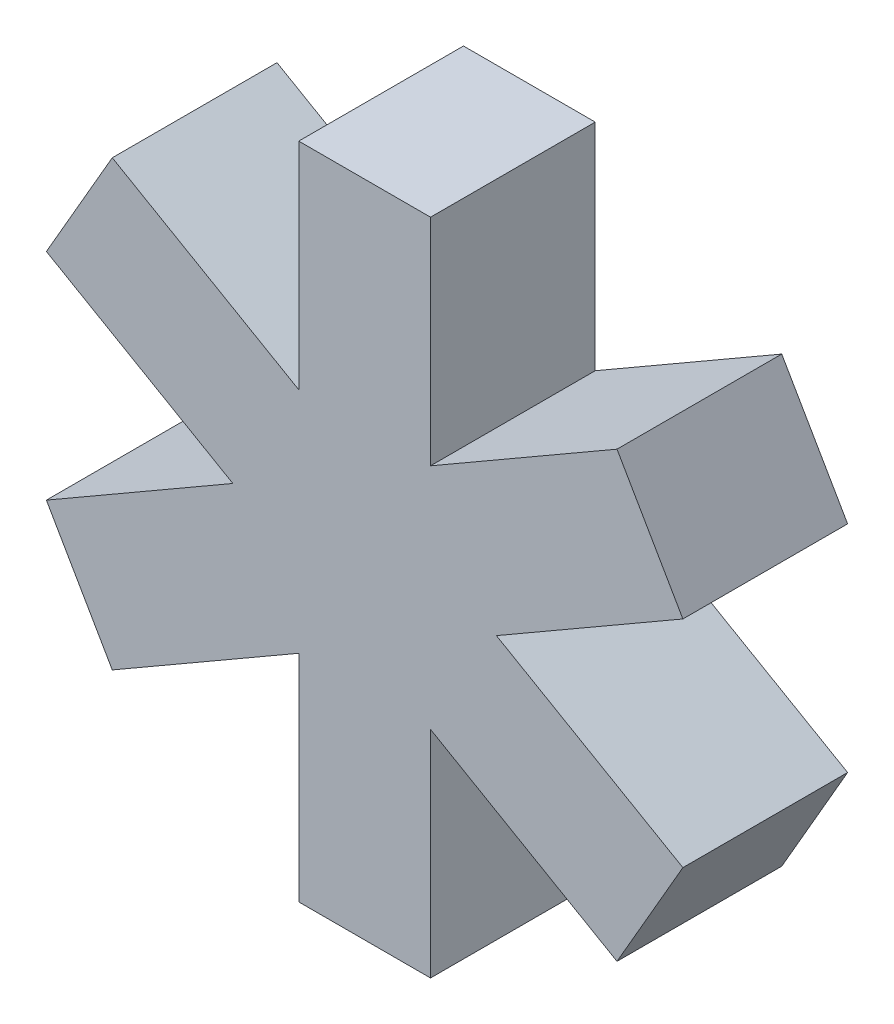
ISO-10303-21;
HEADER;
FILE_DESCRIPTION(('STEP AP214'),'2;1');
FILE_NAME('part.step','',(''),(''),'','','');
FILE_SCHEMA(('AUTOMOTIVE_DESIGN { 1 0 10303 214 1 1 1 1 }'));
ENDSEC;
DATA;
#1=APPLICATION_CONTEXT('core data for automotive mechanical design processes');
#2=APPLICATION_PROTOCOL_DEFINITION('international standard','automotive_design',2000,#1);
#3=PRODUCT_CONTEXT('',#1,'mechanical');
#4=PRODUCT('Part','Part','',(#3));
#5=PRODUCT_RELATED_PRODUCT_CATEGORY('part','',(#4));
#6=PRODUCT_DEFINITION_FORMATION('','',#4);
#7=PRODUCT_DEFINITION_CONTEXT('part definition',#1,'design');
#8=PRODUCT_DEFINITION('design','',#6,#7);
#9=PRODUCT_DEFINITION_SHAPE('','',#8);
#10=(LENGTH_UNIT() NAMED_UNIT(*) SI_UNIT(.MILLI.,.METRE.));
#11=(NAMED_UNIT(*) PLANE_ANGLE_UNIT() SI_UNIT($,.RADIAN.));
#12=(NAMED_UNIT(*) SI_UNIT($,.STERADIAN.) SOLID_ANGLE_UNIT());
#13=UNCERTAINTY_MEASURE_WITH_UNIT(LENGTH_MEASURE(1.E-05),#10,'distance_accuracy_value','');
#14=(GEOMETRIC_REPRESENTATION_CONTEXT(3) GLOBAL_UNCERTAINTY_ASSIGNED_CONTEXT((#13)) GLOBAL_UNIT_ASSIGNED_CONTEXT((#10,
#11,#12)) REPRESENTATION_CONTEXT('',''));
#15=CARTESIAN_POINT('',(0.,0.,0.));
#16=DIRECTION('',(0.,0.,1.));
#17=DIRECTION('',(1.,0.,0.));
#18=AXIS2_PLACEMENT_3D('',#15,#16,#17);
#19=CARTESIAN_POINT('',(-22.9807621135331,20.1961524227066,15.));
#20=DIRECTION('',(0.866025403784439,-0.499999999999999,0.));
#21=DIRECTION('',(0.499999999999999,0.866025403784439,0.));
#22=AXIS2_PLACEMENT_3D('',#19,#20,#21);
#23=PLANE('',#22);
#24=DIRECTION('',(-0.499999999999999,-0.866025403784439,0.));
#25=VECTOR('',#24,1.);
#26=CARTESIAN_POINT('',(-22.9807621135331,20.1961524227066,0.));
#27=LINE('',#26,#25);
#28=CARTESIAN_POINT('',(-22.9807621135331,20.1961524227066,0.));
#29=VERTEX_POINT('',#28);
#30=CARTESIAN_POINT('',(-28.9807621135331,9.80384757729331,0.));
#31=VERTEX_POINT('',#30);
#32=EDGE_CURVE('E189',#29,#31,#27,.T.);
#33=ORIENTED_EDGE('',*,*,#32,.T.);
#34=DIRECTION('',(0.,0.,-1.));
#35=VECTOR('',#34,1.);
#36=CARTESIAN_POINT('',(-28.9807621135331,9.80384757729331,15.));
#37=LINE('',#36,#35);
#38=CARTESIAN_POINT('',(-28.9807621135331,9.80384757729331,15.));
#39=VERTEX_POINT('',#38);
#40=EDGE_CURVE('E11',#39,#31,#37,.T.);
#41=ORIENTED_EDGE('',*,*,#40,.F.);
#42=DIRECTION('',(-0.499999999999999,-0.866025403784439,0.));
#43=VECTOR('',#42,1.);
#44=CARTESIAN_POINT('',(-22.9807621135331,20.1961524227066,15.));
#45=LINE('',#44,#43);
#46=CARTESIAN_POINT('',(-22.9807621135331,20.1961524227066,15.));
#47=VERTEX_POINT('',#46);
#48=EDGE_CURVE('E223',#47,#39,#45,.T.);
#49=ORIENTED_EDGE('',*,*,#48,.F.);
#50=DIRECTION('',(0.,0.,-1.));
#51=VECTOR('',#50,1.);
#52=CARTESIAN_POINT('',(-22.9807621135331,20.1961524227066,15.));
#53=LINE('',#52,#51);
#54=EDGE_CURVE('E185',#47,#29,#53,.T.);
#55=ORIENTED_EDGE('',*,*,#54,.T.);
#56=EDGE_LOOP('',(#33,#41,#49,#55));
#57=FACE_BOUND('',#56,.T.);
#58=ADVANCED_FACE('F33',(#57),#23,.F.);
#59=CARTESIAN_POINT('',(-28.9807621135331,9.80384757729331,15.));
#60=DIRECTION('',(0.499999999999999,0.866025403784439,0.));
#61=DIRECTION('',(-0.866025403784439,0.499999999999999,0.));
#62=AXIS2_PLACEMENT_3D('',#59,#60,#61);
#63=PLANE('',#62);
#64=DIRECTION('',(0.866025403784439,-0.499999999999999,0.));
#65=VECTOR('',#64,1.);
#66=CARTESIAN_POINT('',(-28.9807621135331,9.80384757729331,0.));
#67=LINE('',#66,#65);
#68=CARTESIAN_POINT('',(-12.,0.,0.));
#69=VERTEX_POINT('',#68);
#70=EDGE_CURVE('E192',#31,#69,#67,.T.);
#71=ORIENTED_EDGE('',*,*,#70,.T.);
#72=DIRECTION('',(0.,0.,-1.));
#73=VECTOR('',#72,1.);
#74=CARTESIAN_POINT('',(-12.,0.,15.));
#75=LINE('',#74,#73);
#76=CARTESIAN_POINT('',(-12.,0.,15.));
#77=VERTEX_POINT('',#76);
#78=EDGE_CURVE('E41',#77,#69,#75,.T.);
#79=ORIENTED_EDGE('',*,*,#78,.F.);
#80=DIRECTION('',(0.866025403784439,-0.499999999999999,0.));
#81=VECTOR('',#80,1.);
#82=CARTESIAN_POINT('',(-28.9807621135331,9.80384757729331,15.));
#83=LINE('',#82,#81);
#84=EDGE_CURVE('E122',#39,#77,#83,.T.);
#85=ORIENTED_EDGE('',*,*,#84,.F.);
#86=ORIENTED_EDGE('',*,*,#40,.T.);
#87=EDGE_LOOP('',(#71,#79,#85,#86));
#88=FACE_BOUND('',#87,.T.);
#89=ADVANCED_FACE('F331',(#88),#63,.F.);
#90=CARTESIAN_POINT('',(-12.,0.,15.));
#91=DIRECTION('',(0.5,-0.866025403784439,0.));
#92=DIRECTION('',(0.866025403784439,0.5,0.));
#93=AXIS2_PLACEMENT_3D('',#90,#91,#92);
#94=PLANE('',#93);
#95=DIRECTION('',(-0.866025403784439,-0.5,0.));
#96=VECTOR('',#95,1.);
#97=CARTESIAN_POINT('',(-12.,0.,0.));
#98=LINE('',#97,#96);
#99=CARTESIAN_POINT('',(-28.9807621135331,-9.80384757729338,0.));
#100=VERTEX_POINT('',#99);
#101=EDGE_CURVE('E194',#69,#100,#98,.T.);
#102=ORIENTED_EDGE('',*,*,#101,.T.);
#103=DIRECTION('',(0.,0.,-1.));
#104=VECTOR('',#103,1.);
#105=CARTESIAN_POINT('',(-28.9807621135331,-9.80384757729338,15.));
#106=LINE('',#105,#104);
#107=CARTESIAN_POINT('',(-28.9807621135331,-9.80384757729338,15.));
#108=VERTEX_POINT('',#107);
#109=EDGE_CURVE('E260',#108,#100,#106,.T.);
#110=ORIENTED_EDGE('',*,*,#109,.F.);
#111=DIRECTION('',(-0.866025403784439,-0.5,0.));
#112=VECTOR('',#111,1.);
#113=CARTESIAN_POINT('',(-12.,0.,15.));
#114=LINE('',#113,#112);
#115=EDGE_CURVE('E268',#77,#108,#114,.T.);
#116=ORIENTED_EDGE('',*,*,#115,.F.);
#117=ORIENTED_EDGE('',*,*,#78,.T.);
#118=EDGE_LOOP('',(#102,#110,#116,#117));
#119=FACE_BOUND('',#118,.T.);
#120=ADVANCED_FACE('F266',(#119),#94,.F.);
#121=CARTESIAN_POINT('',(-28.9807621135331,-9.80384757729338,15.));
#122=DIRECTION('',(0.866025403784438,0.5,0.));
#123=DIRECTION('',(-0.5,0.866025403784439,0.));
#124=AXIS2_PLACEMENT_3D('',#121,#122,#123);
#125=PLANE('',#124);
#126=DIRECTION('',(0.5,-0.866025403784438,0.));
#127=VECTOR('',#126,1.);
#128=CARTESIAN_POINT('',(-28.9807621135331,-9.80384757729338,0.));
#129=LINE('',#128,#127);
#130=CARTESIAN_POINT('',(-22.9807621135331,-20.1961524227066,0.));
#131=VERTEX_POINT('',#130);
#132=EDGE_CURVE('E196',#100,#131,#129,.T.);
#133=ORIENTED_EDGE('',*,*,#132,.T.);
#134=DIRECTION('',(0.,0.,-1.));
#135=VECTOR('',#134,1.);
#136=CARTESIAN_POINT('',(-22.9807621135331,-20.1961524227066,15.));
#137=LINE('',#136,#135);
#138=CARTESIAN_POINT('',(-22.9807621135331,-20.1961524227066,15.));
#139=VERTEX_POINT('',#138);
#140=EDGE_CURVE('E257',#139,#131,#137,.T.);
#141=ORIENTED_EDGE('',*,*,#140,.F.);
#142=DIRECTION('',(0.5,-0.866025403784438,0.));
#143=VECTOR('',#142,1.);
#144=CARTESIAN_POINT('',(-28.9807621135331,-9.80384757729338,15.));
#145=LINE('',#144,#143);
#146=EDGE_CURVE('E286',#108,#139,#145,.T.);
#147=ORIENTED_EDGE('',*,*,#146,.F.);
#148=ORIENTED_EDGE('',*,*,#109,.T.);
#149=EDGE_LOOP('',(#133,#141,#147,#148));
#150=FACE_BOUND('',#149,.T.);
#151=ADVANCED_FACE('F277',(#150),#125,.F.);
#152=CARTESIAN_POINT('',(-22.9807621135331,-20.1961524227066,15.));
#153=DIRECTION('',(-0.5,0.866025403784438,0.));
#154=DIRECTION('',(-0.866025403784439,-0.5,0.));
#155=AXIS2_PLACEMENT_3D('',#152,#153,#154);
#156=PLANE('',#155);
#157=DIRECTION('',(0.866025403784439,0.5,0.));
#158=VECTOR('',#157,1.);
#159=CARTESIAN_POINT('',(-22.9807621135331,-20.1961524227066,0.));
#160=LINE('',#159,#158);
#161=CARTESIAN_POINT('',(-6.00000000000001,-10.3923048454133,0.));
#162=VERTEX_POINT('',#161);
#163=EDGE_CURVE('E198',#131,#162,#160,.T.);
#164=ORIENTED_EDGE('',*,*,#163,.T.);
#165=DIRECTION('',(0.,0.,-1.));
#166=VECTOR('',#165,1.);
#167=CARTESIAN_POINT('',(-6.00000000000001,-10.3923048454133,15.));
#168=LINE('',#167,#166);
#169=CARTESIAN_POINT('',(-6.00000000000001,-10.3923048454133,15.));
#170=VERTEX_POINT('',#169);
#171=EDGE_CURVE('E254',#170,#162,#168,.T.);
#172=ORIENTED_EDGE('',*,*,#171,.F.);
#173=DIRECTION('',(0.866025403784439,0.5,0.));
#174=VECTOR('',#173,1.);
#175=CARTESIAN_POINT('',(-22.9807621135331,-20.1961524227066,15.));
#176=LINE('',#175,#174);
#177=EDGE_CURVE('E283',#139,#170,#176,.T.);
#178=ORIENTED_EDGE('',*,*,#177,.F.);
#179=ORIENTED_EDGE('',*,*,#140,.T.);
#180=EDGE_LOOP('',(#164,#172,#178,#179));
#181=FACE_BOUND('',#180,.T.);
#182=ADVANCED_FACE('F281',(#181),#156,.F.);
#183=CARTESIAN_POINT('',(-6.00000000000001,-10.3923048454133,15.));
#184=DIRECTION('',(1.,0.,0.));
#185=DIRECTION('',(0.,0.,-1.));
#186=AXIS2_PLACEMENT_3D('',#183,#184,#185);
#187=PLANE('',#186);
#188=DIRECTION('',(0.,-1.,0.));
#189=VECTOR('',#188,1.);
#190=CARTESIAN_POINT('',(-6.00000000000001,-10.3923048454133,0.));
#191=LINE('',#190,#189);
#192=CARTESIAN_POINT('',(-6.00000000000001,-30.,0.));
#193=VERTEX_POINT('',#192);
#194=EDGE_CURVE('E200',#162,#193,#191,.T.);
#195=ORIENTED_EDGE('',*,*,#194,.T.);
#196=DIRECTION('',(0.,0.,-1.));
#197=VECTOR('',#196,1.);
#198=CARTESIAN_POINT('',(-6.00000000000001,-30.,15.));
#199=LINE('',#198,#197);
#200=CARTESIAN_POINT('',(-6.00000000000001,-30.,15.));
#201=VERTEX_POINT('',#200);
#202=EDGE_CURVE('E251',#201,#193,#199,.T.);
#203=ORIENTED_EDGE('',*,*,#202,.F.);
#204=DIRECTION('',(0.,-1.,0.));
#205=VECTOR('',#204,1.);
#206=CARTESIAN_POINT('',(-6.00000000000001,-10.3923048454133,15.));
#207=LINE('',#206,#205);
#208=EDGE_CURVE('E285',#170,#201,#207,.T.);
#209=ORIENTED_EDGE('',*,*,#208,.F.);
#210=ORIENTED_EDGE('',*,*,#171,.T.);
#211=EDGE_LOOP('',(#195,#203,#209,#210));
#212=FACE_BOUND('',#211,.T.);
#213=ADVANCED_FACE('F344',(#212),#187,.F.);
#214=CARTESIAN_POINT('',(-6.00000000000001,-30.,15.));
#215=DIRECTION('',(0.,1.,0.));
#216=DIRECTION('',(0.,0.,1.));
#217=AXIS2_PLACEMENT_3D('',#214,#215,#216);
#218=PLANE('',#217);
#219=DIRECTION('',(1.,0.,0.));
#220=VECTOR('',#219,1.);
#221=CARTESIAN_POINT('',(-6.00000000000001,-30.,0.));
#222=LINE('',#221,#220);
#223=CARTESIAN_POINT('',(6.00000000000001,-30.,0.));
#224=VERTEX_POINT('',#223);
#225=EDGE_CURVE('E202',#193,#224,#222,.T.);
#226=ORIENTED_EDGE('',*,*,#225,.T.);
#227=DIRECTION('',(0.,0.,-1.));
#228=VECTOR('',#227,1.);
#229=CARTESIAN_POINT('',(6.00000000000001,-30.,15.));
#230=LINE('',#229,#228);
#231=CARTESIAN_POINT('',(6.00000000000001,-30.,15.));
#232=VERTEX_POINT('',#231);
#233=EDGE_CURVE('E248',#232,#224,#230,.T.);
#234=ORIENTED_EDGE('',*,*,#233,.F.);
#235=DIRECTION('',(1.,0.,0.));
#236=VECTOR('',#235,1.);
#237=CARTESIAN_POINT('',(-6.00000000000001,-30.,15.));
#238=LINE('',#237,#236);
#239=EDGE_CURVE('E288',#201,#232,#238,.T.);
#240=ORIENTED_EDGE('',*,*,#239,.F.);
#241=ORIENTED_EDGE('',*,*,#202,.T.);
#242=EDGE_LOOP('',(#226,#234,#240,#241));
#243=FACE_BOUND('',#242,.T.);
#244=ADVANCED_FACE('F347',(#243),#218,.F.);
#245=CARTESIAN_POINT('',(6.00000000000001,-30.,15.));
#246=DIRECTION('',(-1.,0.,0.));
#247=DIRECTION('',(0.,0.,1.));
#248=AXIS2_PLACEMENT_3D('',#245,#246,#247);
#249=PLANE('',#248);
#250=DIRECTION('',(0.,1.,0.));
#251=VECTOR('',#250,1.);
#252=CARTESIAN_POINT('',(6.00000000000001,-30.,0.));
#253=LINE('',#252,#251);
#254=CARTESIAN_POINT('',(6.00000000000001,-10.3923048454132,0.));
#255=VERTEX_POINT('',#254);
#256=EDGE_CURVE('E204',#224,#255,#253,.T.);
#257=ORIENTED_EDGE('',*,*,#256,.T.);
#258=DIRECTION('',(0.,0.,-1.));
#259=VECTOR('',#258,1.);
#260=CARTESIAN_POINT('',(6.00000000000001,-10.3923048454132,15.));
#261=LINE('',#260,#259);
#262=CARTESIAN_POINT('',(6.00000000000001,-10.3923048454132,15.));
#263=VERTEX_POINT('',#262);
#264=EDGE_CURVE('E245',#263,#255,#261,.T.);
#265=ORIENTED_EDGE('',*,*,#264,.F.);
#266=DIRECTION('',(0.,1.,0.));
#267=VECTOR('',#266,1.);
#268=CARTESIAN_POINT('',(6.00000000000001,-30.,15.));
#269=LINE('',#268,#267);
#270=EDGE_CURVE('E294',#232,#263,#269,.T.);
#271=ORIENTED_EDGE('',*,*,#270,.F.);
#272=ORIENTED_EDGE('',*,*,#233,.T.);
#273=EDGE_LOOP('',(#257,#265,#271,#272));
#274=FACE_BOUND('',#273,.T.);
#275=ADVANCED_FACE('F351',(#274),#249,.F.);
#276=CARTESIAN_POINT('',(6.00000000000001,-10.3923048454132,15.));
#277=DIRECTION('',(0.499999999999999,0.866025403784439,0.));
#278=DIRECTION('',(-0.866025403784439,0.499999999999999,0.));
#279=AXIS2_PLACEMENT_3D('',#276,#277,#278);
#280=PLANE('',#279);
#281=DIRECTION('',(0.866025403784439,-0.499999999999999,0.));
#282=VECTOR('',#281,1.);
#283=CARTESIAN_POINT('',(6.00000000000001,-10.3923048454132,0.));
#284=LINE('',#283,#282);
#285=CARTESIAN_POINT('',(22.9807621135332,-20.1961524227066,0.));
#286=VERTEX_POINT('',#285);
#287=EDGE_CURVE('E206',#255,#286,#284,.T.);
#288=ORIENTED_EDGE('',*,*,#287,.T.);
#289=DIRECTION('',(0.,0.,-1.));
#290=VECTOR('',#289,1.);
#291=CARTESIAN_POINT('',(22.9807621135332,-20.1961524227066,15.));
#292=LINE('',#291,#290);
#293=CARTESIAN_POINT('',(22.9807621135332,-20.1961524227066,15.));
#294=VERTEX_POINT('',#293);
#295=EDGE_CURVE('E242',#294,#286,#292,.T.);
#296=ORIENTED_EDGE('',*,*,#295,.F.);
#297=DIRECTION('',(0.866025403784439,-0.499999999999999,0.));
#298=VECTOR('',#297,1.);
#299=CARTESIAN_POINT('',(6.00000000000001,-10.3923048454132,15.));
#300=LINE('',#299,#298);
#301=EDGE_CURVE('E296',#263,#294,#300,.T.);
#302=ORIENTED_EDGE('',*,*,#301,.F.);
#303=ORIENTED_EDGE('',*,*,#264,.T.);
#304=EDGE_LOOP('',(#288,#296,#302,#303));
#305=FACE_BOUND('',#304,.T.);
#306=ADVANCED_FACE('F355',(#305),#280,.F.);
#307=CARTESIAN_POINT('',(22.9807621135332,-20.1961524227066,15.));
#308=DIRECTION('',(-0.866025403784439,0.499999999999999,0.));
#309=DIRECTION('',(-0.499999999999999,-0.866025403784439,0.));
#310=AXIS2_PLACEMENT_3D('',#307,#308,#309);
#311=PLANE('',#310);
#312=DIRECTION('',(0.499999999999999,0.866025403784439,0.));
#313=VECTOR('',#312,1.);
#314=CARTESIAN_POINT('',(22.9807621135332,-20.1961524227066,0.));
#315=LINE('',#314,#313);
#316=CARTESIAN_POINT('',(28.9807621135331,-9.80384757729333,0.));
#317=VERTEX_POINT('',#316);
#318=EDGE_CURVE('E208',#286,#317,#315,.T.);
#319=ORIENTED_EDGE('',*,*,#318,.T.);
#320=DIRECTION('',(0.,0.,-1.));
#321=VECTOR('',#320,1.);
#322=CARTESIAN_POINT('',(28.9807621135331,-9.80384757729333,15.));
#323=LINE('',#322,#321);
#324=CARTESIAN_POINT('',(28.9807621135331,-9.80384757729333,15.));
#325=VERTEX_POINT('',#324);
#326=EDGE_CURVE('E239',#325,#317,#323,.T.);
#327=ORIENTED_EDGE('',*,*,#326,.F.);
#328=DIRECTION('',(0.499999999999999,0.866025403784439,0.));
#329=VECTOR('',#328,1.);
#330=CARTESIAN_POINT('',(22.9807621135332,-20.1961524227066,15.));
#331=LINE('',#330,#329);
#332=EDGE_CURVE('E298',#294,#325,#331,.T.);
#333=ORIENTED_EDGE('',*,*,#332,.F.);
#334=ORIENTED_EDGE('',*,*,#295,.T.);
#335=EDGE_LOOP('',(#319,#327,#333,#334));
#336=FACE_BOUND('',#335,.T.);
#337=ADVANCED_FACE('F359',(#336),#311,.F.);
#338=CARTESIAN_POINT('',(28.9807621135331,-9.80384757729333,15.));
#339=DIRECTION('',(-0.499999999999999,-0.866025403784439,0.));
#340=DIRECTION('',(0.866025403784439,-0.5,0.));
#341=AXIS2_PLACEMENT_3D('',#338,#339,#340);
#342=PLANE('',#341);
#343=DIRECTION('',(-0.866025403784439,0.499999999999999,0.));
#344=VECTOR('',#343,1.);
#345=CARTESIAN_POINT('',(28.9807621135331,-9.80384757729333,0.));
#346=LINE('',#345,#344);
#347=CARTESIAN_POINT('',(12.,0.,0.));
#348=VERTEX_POINT('',#347);
#349=EDGE_CURVE('E210',#317,#348,#346,.T.);
#350=ORIENTED_EDGE('',*,*,#349,.T.);
#351=DIRECTION('',(0.,0.,-1.));
#352=VECTOR('',#351,1.);
#353=CARTESIAN_POINT('',(12.,0.,15.));
#354=LINE('',#353,#352);
#355=CARTESIAN_POINT('',(12.,0.,15.));
#356=VERTEX_POINT('',#355);
#357=EDGE_CURVE('E236',#356,#348,#354,.T.);
#358=ORIENTED_EDGE('',*,*,#357,.F.);
#359=DIRECTION('',(-0.866025403784439,0.499999999999999,0.));
#360=VECTOR('',#359,1.);
#361=CARTESIAN_POINT('',(28.9807621135331,-9.80384757729333,15.));
#362=LINE('',#361,#360);
#363=EDGE_CURVE('E300',#325,#356,#362,.T.);
#364=ORIENTED_EDGE('',*,*,#363,.F.);
#365=ORIENTED_EDGE('',*,*,#326,.T.);
#366=EDGE_LOOP('',(#350,#358,#364,#365));
#367=FACE_BOUND('',#366,.T.);
#368=ADVANCED_FACE('F363',(#367),#342,.F.);
#369=CARTESIAN_POINT('',(12.,0.,15.));
#370=DIRECTION('',(-0.5,0.866025403784438,0.));
#371=DIRECTION('',(-0.866025403784439,-0.5,0.));
#372=AXIS2_PLACEMENT_3D('',#369,#370,#371);
#373=PLANE('',#372);
#374=DIRECTION('',(0.866025403784439,0.5,0.));
#375=VECTOR('',#374,1.);
#376=CARTESIAN_POINT('',(12.,0.,0.));
#377=LINE('',#376,#375);
#378=CARTESIAN_POINT('',(28.9807621135332,9.80384757729336,0.));
#379=VERTEX_POINT('',#378);
#380=EDGE_CURVE('E212',#348,#379,#377,.T.);
#381=ORIENTED_EDGE('',*,*,#380,.T.);
#382=DIRECTION('',(0.,0.,-1.));
#383=VECTOR('',#382,1.);
#384=CARTESIAN_POINT('',(28.9807621135332,9.80384757729336,15.));
#385=LINE('',#384,#383);
#386=CARTESIAN_POINT('',(28.9807621135332,9.80384757729336,15.));
#387=VERTEX_POINT('',#386);
#388=EDGE_CURVE('E233',#387,#379,#385,.T.);
#389=ORIENTED_EDGE('',*,*,#388,.F.);
#390=DIRECTION('',(0.866025403784439,0.5,0.));
#391=VECTOR('',#390,1.);
#392=CARTESIAN_POINT('',(12.,0.,15.));
#393=LINE('',#392,#391);
#394=EDGE_CURVE('E302',#356,#387,#393,.T.);
#395=ORIENTED_EDGE('',*,*,#394,.F.);
#396=ORIENTED_EDGE('',*,*,#357,.T.);
#397=EDGE_LOOP('',(#381,#389,#395,#396));
#398=FACE_BOUND('',#397,.T.);
#399=ADVANCED_FACE('F367',(#398),#373,.F.);
#400=CARTESIAN_POINT('',(28.9807621135332,9.80384757729336,15.));
#401=DIRECTION('',(-0.866025403784438,-0.5,0.));
#402=DIRECTION('',(0.5,-0.866025403784438,0.));
#403=AXIS2_PLACEMENT_3D('',#400,#401,#402);
#404=PLANE('',#403);
#405=DIRECTION('',(-0.5,0.866025403784438,0.));
#406=VECTOR('',#405,1.);
#407=CARTESIAN_POINT('',(28.9807621135332,9.80384757729336,0.));
#408=LINE('',#407,#406);
#409=CARTESIAN_POINT('',(22.9807621135331,20.1961524227066,0.));
#410=VERTEX_POINT('',#409);
#411=EDGE_CURVE('E214',#379,#410,#408,.T.);
#412=ORIENTED_EDGE('',*,*,#411,.T.);
#413=DIRECTION('',(0.,0.,-1.));
#414=VECTOR('',#413,1.);
#415=CARTESIAN_POINT('',(22.9807621135331,20.1961524227066,15.));
#416=LINE('',#415,#414);
#417=CARTESIAN_POINT('',(22.9807621135331,20.1961524227066,15.));
#418=VERTEX_POINT('',#417);
#419=EDGE_CURVE('E230',#418,#410,#416,.T.);
#420=ORIENTED_EDGE('',*,*,#419,.F.);
#421=DIRECTION('',(-0.5,0.866025403784438,0.));
#422=VECTOR('',#421,1.);
#423=CARTESIAN_POINT('',(28.9807621135332,9.80384757729336,15.));
#424=LINE('',#423,#422);
#425=EDGE_CURVE('E304',#387,#418,#424,.T.);
#426=ORIENTED_EDGE('',*,*,#425,.F.);
#427=ORIENTED_EDGE('',*,*,#388,.T.);
#428=EDGE_LOOP('',(#412,#420,#426,#427));
#429=FACE_BOUND('',#428,.T.);
#430=ADVANCED_FACE('F371',(#429),#404,.F.);
#431=CARTESIAN_POINT('',(22.9807621135331,20.1961524227066,15.));
#432=DIRECTION('',(0.5,-0.866025403784438,0.));
#433=DIRECTION('',(0.866025403784438,0.500000000000001,0.));
#434=AXIS2_PLACEMENT_3D('',#431,#432,#433);
#435=PLANE('',#434);
#436=DIRECTION('',(-0.866025403784438,-0.5,0.));
#437=VECTOR('',#436,1.);
#438=CARTESIAN_POINT('',(22.9807621135331,20.1961524227066,0.));
#439=LINE('',#438,#437);
#440=CARTESIAN_POINT('',(6.,10.3923048454133,0.));
#441=VERTEX_POINT('',#440);
#442=EDGE_CURVE('E216',#410,#441,#439,.T.);
#443=ORIENTED_EDGE('',*,*,#442,.T.);
#444=DIRECTION('',(0.,0.,-1.));
#445=VECTOR('',#444,1.);
#446=CARTESIAN_POINT('',(6.,10.3923048454133,15.));
#447=LINE('',#446,#445);
#448=CARTESIAN_POINT('',(6.,10.3923048454133,15.));
#449=VERTEX_POINT('',#448);
#450=EDGE_CURVE('E227',#449,#441,#447,.T.);
#451=ORIENTED_EDGE('',*,*,#450,.F.);
#452=DIRECTION('',(-0.866025403784438,-0.5,0.));
#453=VECTOR('',#452,1.);
#454=CARTESIAN_POINT('',(22.9807621135331,20.1961524227066,15.));
#455=LINE('',#454,#453);
#456=EDGE_CURVE('E306',#418,#449,#455,.T.);
#457=ORIENTED_EDGE('',*,*,#456,.F.);
#458=ORIENTED_EDGE('',*,*,#419,.T.);
#459=EDGE_LOOP('',(#443,#451,#457,#458));
#460=FACE_BOUND('',#459,.T.);
#461=ADVANCED_FACE('F312',(#460),#435,.F.);
#462=CARTESIAN_POINT('',(6.,10.3923048454133,15.));
#463=DIRECTION('',(-1.,0.,0.));
#464=DIRECTION('',(0.,0.,1.));
#465=AXIS2_PLACEMENT_3D('',#462,#463,#464);
#466=PLANE('',#465);
#467=DIRECTION('',(0.,1.,0.));
#468=VECTOR('',#467,1.);
#469=CARTESIAN_POINT('',(6.,10.3923048454133,0.));
#470=LINE('',#469,#468);
#471=CARTESIAN_POINT('',(6.,30.,0.));
#472=VERTEX_POINT('',#471);
#473=EDGE_CURVE('E218',#441,#472,#470,.T.);
#474=ORIENTED_EDGE('',*,*,#473,.T.);
#475=DIRECTION('',(0.,0.,-1.));
#476=VECTOR('',#475,1.);
#477=CARTESIAN_POINT('',(6.,30.,15.));
#478=LINE('',#477,#476);
#479=CARTESIAN_POINT('',(6.,30.,15.));
#480=VERTEX_POINT('',#479);
#481=EDGE_CURVE('E180',#480,#472,#478,.T.);
#482=ORIENTED_EDGE('',*,*,#481,.F.);
#483=DIRECTION('',(0.,1.,0.));
#484=VECTOR('',#483,1.);
#485=CARTESIAN_POINT('',(6.,10.3923048454133,15.));
#486=LINE('',#485,#484);
#487=EDGE_CURVE('E171',#449,#480,#486,.T.);
#488=ORIENTED_EDGE('',*,*,#487,.F.);
#489=ORIENTED_EDGE('',*,*,#450,.T.);
#490=EDGE_LOOP('',(#474,#482,#488,#489));
#491=FACE_BOUND('',#490,.T.);
#492=ADVANCED_FACE('F316',(#491),#466,.F.);
#493=CARTESIAN_POINT('',(6.,30.,15.));
#494=DIRECTION('',(0.,-1.,0.));
#495=DIRECTION('',(1.,0.,0.));
#496=AXIS2_PLACEMENT_3D('',#493,#494,#495);
#497=PLANE('',#496);
#498=DIRECTION('',(-1.,0.,0.));
#499=VECTOR('',#498,1.);
#500=CARTESIAN_POINT('',(6.,30.,0.));
#501=LINE('',#500,#499);
#502=CARTESIAN_POINT('',(-6.,30.,0.));
#503=VERTEX_POINT('',#502);
#504=EDGE_CURVE('E179',#472,#503,#501,.T.);
#505=ORIENTED_EDGE('',*,*,#504,.T.);
#506=DIRECTION('',(0.,0.,-1.));
#507=VECTOR('',#506,1.);
#508=CARTESIAN_POINT('',(-6.,30.,15.));
#509=LINE('',#508,#507);
#510=CARTESIAN_POINT('',(-6.,30.,15.));
#511=VERTEX_POINT('',#510);
#512=EDGE_CURVE('E176',#511,#503,#509,.T.);
#513=ORIENTED_EDGE('',*,*,#512,.F.);
#514=DIRECTION('',(-1.,0.,0.));
#515=VECTOR('',#514,1.);
#516=CARTESIAN_POINT('',(6.,30.,15.));
#517=LINE('',#516,#515);
#518=EDGE_CURVE('E165',#480,#511,#517,.T.);
#519=ORIENTED_EDGE('',*,*,#518,.F.);
#520=ORIENTED_EDGE('',*,*,#481,.T.);
#521=EDGE_LOOP('',(#505,#513,#519,#520));
#522=FACE_BOUND('',#521,.T.);
#523=ADVANCED_FACE('F177',(#522),#497,.F.);
#524=CARTESIAN_POINT('',(-6.,30.,15.));
#525=DIRECTION('',(1.,0.,0.));
#526=DIRECTION('',(0.,0.,-1.));
#527=AXIS2_PLACEMENT_3D('',#524,#525,#526);
#528=PLANE('',#527);
#529=DIRECTION('',(0.,-1.,0.));
#530=VECTOR('',#529,1.);
#531=CARTESIAN_POINT('',(-6.,30.,0.));
#532=LINE('',#531,#530);
#533=CARTESIAN_POINT('',(-6.,10.3923048454132,0.));
#534=VERTEX_POINT('',#533);
#535=EDGE_CURVE('E108',#503,#534,#532,.T.);
#536=ORIENTED_EDGE('',*,*,#535,.T.);
#537=DIRECTION('',(0.,0.,-1.));
#538=VECTOR('',#537,1.);
#539=CARTESIAN_POINT('',(-6.,10.3923048454132,15.));
#540=LINE('',#539,#538);
#541=CARTESIAN_POINT('',(-6.,10.3923048454132,15.));
#542=VERTEX_POINT('',#541);
#543=EDGE_CURVE('E181',#542,#534,#540,.T.);
#544=ORIENTED_EDGE('',*,*,#543,.F.);
#545=DIRECTION('',(0.,-1.,0.));
#546=VECTOR('',#545,1.);
#547=CARTESIAN_POINT('',(-6.,30.,15.));
#548=LINE('',#547,#546);
#549=EDGE_CURVE('E169',#511,#542,#548,.T.);
#550=ORIENTED_EDGE('',*,*,#549,.F.);
#551=ORIENTED_EDGE('',*,*,#512,.T.);
#552=EDGE_LOOP('',(#536,#544,#550,#551));
#553=FACE_BOUND('',#552,.T.);
#554=ADVANCED_FACE('F183',(#553),#528,.F.);
#555=CARTESIAN_POINT('',(-6.,10.3923048454132,15.));
#556=DIRECTION('',(-0.499999999999999,-0.866025403784439,0.));
#557=DIRECTION('',(0.866025403784439,-0.499999999999999,0.));
#558=AXIS2_PLACEMENT_3D('',#555,#556,#557);
#559=PLANE('',#558);
#560=DIRECTION('',(-0.866025403784439,0.499999999999999,0.));
#561=VECTOR('',#560,1.);
#562=CARTESIAN_POINT('',(-6.,10.3923048454132,0.));
#563=LINE('',#562,#561);
#564=EDGE_CURVE('E114',#534,#29,#563,.T.);
#565=ORIENTED_EDGE('',*,*,#564,.T.);
#566=ORIENTED_EDGE('',*,*,#54,.F.);
#567=DIRECTION('',(-0.866025403784439,0.499999999999999,0.));
#568=VECTOR('',#567,1.);
#569=CARTESIAN_POINT('',(-6.,10.3923048454132,15.));
#570=LINE('',#569,#568);
#571=EDGE_CURVE('E49',#542,#47,#570,.T.);
#572=ORIENTED_EDGE('',*,*,#571,.F.);
#573=ORIENTED_EDGE('',*,*,#543,.T.);
#574=EDGE_LOOP('',(#565,#566,#572,#573));
#575=FACE_BOUND('',#574,.T.);
#576=ADVANCED_FACE('F320',(#575),#559,.F.);
#577=CARTESIAN_POINT('',(0.,0.,15.));
#578=DIRECTION('',(0.,0.,1.));
#579=DIRECTION('',(1.,0.,0.));
#580=AXIS2_PLACEMENT_3D('',#577,#578,#579);
#581=PLANE('',#580);
#582=ORIENTED_EDGE('',*,*,#48,.T.);
#583=ORIENTED_EDGE('',*,*,#84,.T.);
#584=ORIENTED_EDGE('',*,*,#115,.T.);
#585=ORIENTED_EDGE('',*,*,#146,.T.);
#586=ORIENTED_EDGE('',*,*,#177,.T.);
#587=ORIENTED_EDGE('',*,*,#208,.T.);
#588=ORIENTED_EDGE('',*,*,#239,.T.);
#589=ORIENTED_EDGE('',*,*,#270,.T.);
#590=ORIENTED_EDGE('',*,*,#301,.T.);
#591=ORIENTED_EDGE('',*,*,#332,.T.);
#592=ORIENTED_EDGE('',*,*,#363,.T.);
#593=ORIENTED_EDGE('',*,*,#394,.T.);
#594=ORIENTED_EDGE('',*,*,#425,.T.);
#595=ORIENTED_EDGE('',*,*,#456,.T.);
#596=ORIENTED_EDGE('',*,*,#487,.T.);
#597=ORIENTED_EDGE('',*,*,#518,.T.);
#598=ORIENTED_EDGE('',*,*,#549,.T.);
#599=ORIENTED_EDGE('',*,*,#571,.T.);
#600=EDGE_LOOP('',(#582,#583,#584,#585,#586,#587,#588,#589,#590,#591,#592,#593,#594,#595,#596,
#597,#598,#599));
#601=FACE_BOUND('',#600,.T.);
#602=ADVANCED_FACE('F167',(#601),#581,.T.);
#603=CARTESIAN_POINT('',(0.,0.,0.));
#604=DIRECTION('',(0.,0.,1.));
#605=DIRECTION('',(1.,0.,0.));
#606=AXIS2_PLACEMENT_3D('',#603,#604,#605);
#607=PLANE('',#606);
#608=ORIENTED_EDGE('',*,*,#32,.F.);
#609=ORIENTED_EDGE('',*,*,#564,.F.);
#610=ORIENTED_EDGE('',*,*,#535,.F.);
#611=ORIENTED_EDGE('',*,*,#504,.F.);
#612=ORIENTED_EDGE('',*,*,#473,.F.);
#613=ORIENTED_EDGE('',*,*,#442,.F.);
#614=ORIENTED_EDGE('',*,*,#411,.F.);
#615=ORIENTED_EDGE('',*,*,#380,.F.);
#616=ORIENTED_EDGE('',*,*,#349,.F.);
#617=ORIENTED_EDGE('',*,*,#318,.F.);
#618=ORIENTED_EDGE('',*,*,#287,.F.);
#619=ORIENTED_EDGE('',*,*,#256,.F.);
#620=ORIENTED_EDGE('',*,*,#225,.F.);
#621=ORIENTED_EDGE('',*,*,#194,.F.);
#622=ORIENTED_EDGE('',*,*,#163,.F.);
#623=ORIENTED_EDGE('',*,*,#132,.F.);
#624=ORIENTED_EDGE('',*,*,#101,.F.);
#625=ORIENTED_EDGE('',*,*,#70,.F.);
#626=EDGE_LOOP('',(#608,#609,#610,#611,#612,#613,#614,#615,#616,#617,#618,#619,#620,#621,#622,
#623,#624,#625));
#627=FACE_BOUND('',#626,.T.);
#628=ADVANCED_FACE('F272',(#627),#607,.F.);
#629=CLOSED_SHELL('',(#58,#89,#120,#151,#182,#213,#244,#275,#306,#337,#368,#399,#430,#461,#492,
#523,#554,#576,#602,#628));
#630=MANIFOLD_SOLID_BREP('B2',#629);
#631=ADVANCED_BREP_SHAPE_REPRESENTATION('',(#18,#630),#14);
#632=SHAPE_DEFINITION_REPRESENTATION(#9,#631);
ENDSEC;
END-ISO-10303-21;
